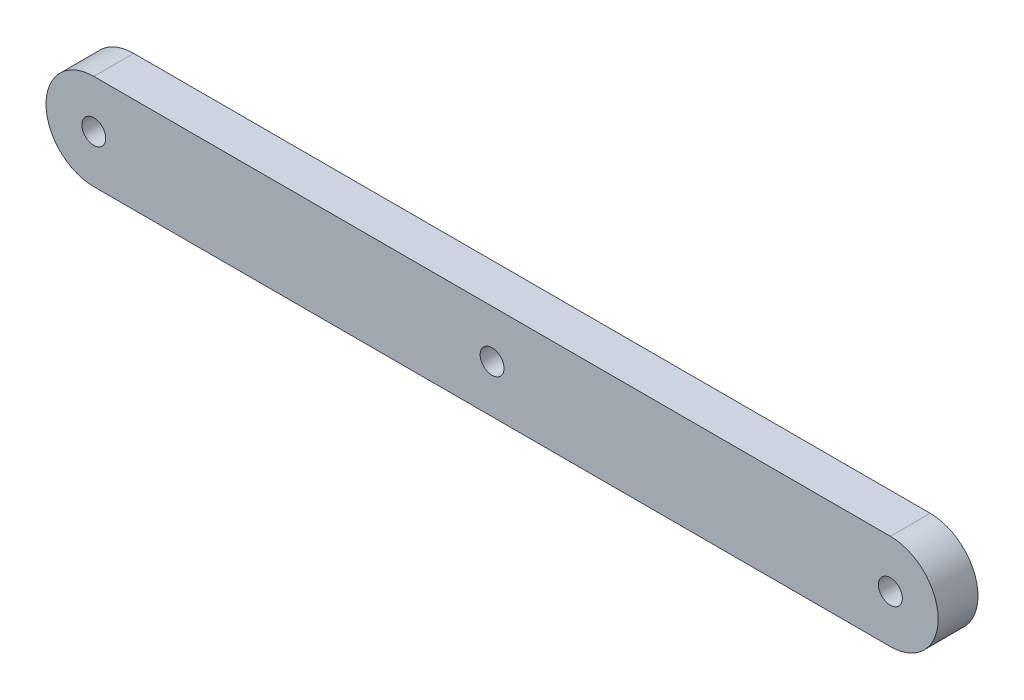
ISO-10303-21;
HEADER;
FILE_DESCRIPTION(('STEP AP214'),'2;1');
FILE_NAME('part.step','',(''),(''),'','','');
FILE_SCHEMA(('AUTOMOTIVE_DESIGN { 1 0 10303 214 1 1 1 1 }'));
ENDSEC;
DATA;
#1=APPLICATION_CONTEXT('core data for automotive mechanical design processes');
#2=APPLICATION_PROTOCOL_DEFINITION('international standard','automotive_design',2000,#1);
#3=PRODUCT_CONTEXT('',#1,'mechanical');
#4=PRODUCT('Part','Part','',(#3));
#5=PRODUCT_RELATED_PRODUCT_CATEGORY('part','',(#4));
#6=PRODUCT_DEFINITION_FORMATION('','',#4);
#7=PRODUCT_DEFINITION_CONTEXT('part definition',#1,'design');
#8=PRODUCT_DEFINITION('design','',#6,#7);
#9=PRODUCT_DEFINITION_SHAPE('','',#8);
#10=(LENGTH_UNIT() NAMED_UNIT(*) SI_UNIT(.MILLI.,.METRE.));
#11=(NAMED_UNIT(*) PLANE_ANGLE_UNIT() SI_UNIT($,.RADIAN.));
#12=(NAMED_UNIT(*) SI_UNIT($,.STERADIAN.) SOLID_ANGLE_UNIT());
#13=UNCERTAINTY_MEASURE_WITH_UNIT(LENGTH_MEASURE(1.E-05),#10,'distance_accuracy_value','');
#14=(GEOMETRIC_REPRESENTATION_CONTEXT(3) GLOBAL_UNCERTAINTY_ASSIGNED_CONTEXT((#13)) GLOBAL_UNIT_ASSIGNED_CONTEXT((#10,
#11,#12)) REPRESENTATION_CONTEXT('',''));
#15=CARTESIAN_POINT('',(0.,0.,0.));
#16=DIRECTION('',(0.,0.,1.));
#17=DIRECTION('',(1.,0.,0.));
#18=AXIS2_PLACEMENT_3D('',#15,#16,#17);
#19=CARTESIAN_POINT('',(-50.,0.,5.));
#20=DIRECTION('',(0.,0.,1.));
#21=DIRECTION('',(1.,0.,0.));
#22=AXIS2_PLACEMENT_3D('',#19,#20,#21);
#23=PLANE('',#22);
#24=CARTESIAN_POINT('',(50.,0.,5.));
#25=DIRECTION('',(0.,0.,1.));
#26=DIRECTION('',(1.,0.,0.));
#27=AXIS2_PLACEMENT_3D('',#24,#25,#26);
#28=CIRCLE('',#27,1.5);
#29=CARTESIAN_POINT('',(51.5,0.,5.));
#30=VERTEX_POINT('',#29);
#31=EDGE_CURVE('E115',#30,#30,#28,.T.);
#32=ORIENTED_EDGE('',*,*,#31,.F.);
#33=EDGE_LOOP('',(#32));
#34=FACE_BOUND('',#33,.T.);
#35=CARTESIAN_POINT('',(-50.,0.,5.));
#36=DIRECTION('',(0.,0.,1.));
#37=DIRECTION('',(1.,0.,0.));
#38=AXIS2_PLACEMENT_3D('',#35,#36,#37);
#39=CIRCLE('',#38,6.);
#40=CARTESIAN_POINT('',(-50.,6.,5.));
#41=VERTEX_POINT('',#40);
#42=CARTESIAN_POINT('',(-50.,-6.,5.));
#43=VERTEX_POINT('',#42);
#44=EDGE_CURVE('E85',#41,#43,#39,.T.);
#45=ORIENTED_EDGE('',*,*,#44,.T.);
#46=DIRECTION('',(1.,0.,0.));
#47=VECTOR('',#46,1.);
#48=CARTESIAN_POINT('',(-50.,-6.,5.));
#49=LINE('',#48,#47);
#50=CARTESIAN_POINT('',(50.,-6.,5.));
#51=VERTEX_POINT('',#50);
#52=EDGE_CURVE('E80',#43,#51,#49,.T.);
#53=ORIENTED_EDGE('',*,*,#52,.T.);
#54=CARTESIAN_POINT('',(50.,0.,5.));
#55=DIRECTION('',(0.,0.,1.));
#56=DIRECTION('',(1.,0.,0.));
#57=AXIS2_PLACEMENT_3D('',#54,#55,#56);
#58=CIRCLE('',#57,6.);
#59=CARTESIAN_POINT('',(50.,6.,5.));
#60=VERTEX_POINT('',#59);
#61=EDGE_CURVE('E83',#51,#60,#58,.T.);
#62=ORIENTED_EDGE('',*,*,#61,.T.);
#63=DIRECTION('',(-1.,0.,0.));
#64=VECTOR('',#63,1.);
#65=CARTESIAN_POINT('',(-50.,6.,5.));
#66=LINE('',#65,#64);
#67=EDGE_CURVE('E50',#60,#41,#66,.T.);
#68=ORIENTED_EDGE('',*,*,#67,.T.);
#69=EDGE_LOOP('',(#45,#53,#62,#68));
#70=FACE_BOUND('',#69,.T.);
#71=CARTESIAN_POINT('',(-50.,0.,5.));
#72=DIRECTION('',(0.,0.,1.));
#73=DIRECTION('',(1.,0.,0.));
#74=AXIS2_PLACEMENT_3D('',#71,#72,#73);
#75=CIRCLE('',#74,1.5);
#76=CARTESIAN_POINT('',(-48.5,0.,5.));
#77=VERTEX_POINT('',#76);
#78=EDGE_CURVE('E100',#77,#77,#75,.T.);
#79=ORIENTED_EDGE('',*,*,#78,.F.);
#80=EDGE_LOOP('',(#79));
#81=FACE_BOUND('',#80,.T.);
#82=CARTESIAN_POINT('',(0.,0.,5.));
#83=DIRECTION('',(0.,0.,1.));
#84=DIRECTION('',(1.,0.,0.));
#85=AXIS2_PLACEMENT_3D('',#82,#83,#84);
#86=CIRCLE('',#85,1.5);
#87=CARTESIAN_POINT('',(1.5,0.,5.));
#88=VERTEX_POINT('',#87);
#89=EDGE_CURVE('E121',#88,#88,#86,.T.);
#90=ORIENTED_EDGE('',*,*,#89,.F.);
#91=EDGE_LOOP('',(#90));
#92=FACE_BOUND('',#91,.T.);
#93=ADVANCED_FACE('F33',(#34,#70,#81,#92),#23,.T.);
#94=CARTESIAN_POINT('',(-50.,0.,0.));
#95=DIRECTION('',(0.,0.,1.));
#96=DIRECTION('',(1.,0.,0.));
#97=AXIS2_PLACEMENT_3D('',#94,#95,#96);
#98=PLANE('',#97);
#99=CARTESIAN_POINT('',(-50.,0.,0.));
#100=DIRECTION('',(0.,0.,1.));
#101=DIRECTION('',(1.,0.,0.));
#102=AXIS2_PLACEMENT_3D('',#99,#100,#101);
#103=CIRCLE('',#102,6.);
#104=CARTESIAN_POINT('',(-50.,6.,0.));
#105=VERTEX_POINT('',#104);
#106=CARTESIAN_POINT('',(-50.,-6.,0.));
#107=VERTEX_POINT('',#106);
#108=EDGE_CURVE('E97',#105,#107,#103,.T.);
#109=ORIENTED_EDGE('',*,*,#108,.F.);
#110=DIRECTION('',(-1.,0.,0.));
#111=VECTOR('',#110,1.);
#112=CARTESIAN_POINT('',(-50.,6.,0.));
#113=LINE('',#112,#111);
#114=CARTESIAN_POINT('',(50.,6.,0.));
#115=VERTEX_POINT('',#114);
#116=EDGE_CURVE('E73',#115,#105,#113,.T.);
#117=ORIENTED_EDGE('',*,*,#116,.F.);
#118=CARTESIAN_POINT('',(50.,0.,0.));
#119=DIRECTION('',(0.,0.,1.));
#120=DIRECTION('',(1.,0.,0.));
#121=AXIS2_PLACEMENT_3D('',#118,#119,#120);
#122=CIRCLE('',#121,6.);
#123=CARTESIAN_POINT('',(50.,-6.,0.));
#124=VERTEX_POINT('',#123);
#125=EDGE_CURVE('E67',#124,#115,#122,.T.);
#126=ORIENTED_EDGE('',*,*,#125,.F.);
#127=DIRECTION('',(1.,0.,0.));
#128=VECTOR('',#127,1.);
#129=CARTESIAN_POINT('',(-50.,-6.,0.));
#130=LINE('',#129,#128);
#131=EDGE_CURVE('E89',#107,#124,#130,.T.);
#132=ORIENTED_EDGE('',*,*,#131,.F.);
#133=EDGE_LOOP('',(#109,#117,#126,#132));
#134=FACE_BOUND('',#133,.T.);
#135=CARTESIAN_POINT('',(-50.,0.,0.));
#136=DIRECTION('',(0.,0.,1.));
#137=DIRECTION('',(1.,0.,0.));
#138=AXIS2_PLACEMENT_3D('',#135,#136,#137);
#139=CIRCLE('',#138,1.5);
#140=CARTESIAN_POINT('',(-48.5,0.,0.));
#141=VERTEX_POINT('',#140);
#142=EDGE_CURVE('E112',#141,#141,#139,.T.);
#143=ORIENTED_EDGE('',*,*,#142,.T.);
#144=EDGE_LOOP('',(#143));
#145=FACE_BOUND('',#144,.T.);
#146=CARTESIAN_POINT('',(50.,0.,0.));
#147=DIRECTION('',(0.,0.,1.));
#148=DIRECTION('',(1.,0.,0.));
#149=AXIS2_PLACEMENT_3D('',#146,#147,#148);
#150=CIRCLE('',#149,1.5);
#151=CARTESIAN_POINT('',(51.5,0.,0.));
#152=VERTEX_POINT('',#151);
#153=EDGE_CURVE('E118',#152,#152,#150,.T.);
#154=ORIENTED_EDGE('',*,*,#153,.T.);
#155=EDGE_LOOP('',(#154));
#156=FACE_BOUND('',#155,.T.);
#157=CARTESIAN_POINT('',(0.,0.,0.));
#158=DIRECTION('',(0.,0.,1.));
#159=DIRECTION('',(1.,0.,0.));
#160=AXIS2_PLACEMENT_3D('',#157,#158,#159);
#161=CIRCLE('',#160,1.5);
#162=CARTESIAN_POINT('',(1.5,0.,0.));
#163=VERTEX_POINT('',#162);
#164=EDGE_CURVE('E124',#163,#163,#161,.T.);
#165=ORIENTED_EDGE('',*,*,#164,.T.);
#166=EDGE_LOOP('',(#165));
#167=FACE_BOUND('',#166,.T.);
#168=ADVANCED_FACE('F108',(#134,#145,#156,#167),#98,.F.);
#169=CARTESIAN_POINT('',(-50.,0.,5.));
#170=DIRECTION('',(0.,0.,-1.));
#171=DIRECTION('',(-1.,0.,0.));
#172=AXIS2_PLACEMENT_3D('',#169,#170,#171);
#173=CYLINDRICAL_SURFACE('',#172,6.);
#174=ORIENTED_EDGE('',*,*,#108,.T.);
#175=DIRECTION('',(0.,0.,-1.));
#176=VECTOR('',#175,1.);
#177=CARTESIAN_POINT('',(-50.,-6.,5.));
#178=LINE('',#177,#176);
#179=EDGE_CURVE('E11',#43,#107,#178,.T.);
#180=ORIENTED_EDGE('',*,*,#179,.F.);
#181=ORIENTED_EDGE('',*,*,#44,.F.);
#182=DIRECTION('',(0.,0.,-1.));
#183=VECTOR('',#182,1.);
#184=CARTESIAN_POINT('',(-50.,6.,5.));
#185=LINE('',#184,#183);
#186=EDGE_CURVE('E93',#41,#105,#185,.T.);
#187=ORIENTED_EDGE('',*,*,#186,.T.);
#188=EDGE_LOOP('',(#174,#180,#181,#187));
#189=FACE_BOUND('',#188,.T.);
#190=ADVANCED_FACE('F35',(#189),#173,.T.);
#191=CARTESIAN_POINT('',(-50.,-6.,5.));
#192=DIRECTION('',(0.,1.,0.));
#193=DIRECTION('',(0.,0.,1.));
#194=AXIS2_PLACEMENT_3D('',#191,#192,#193);
#195=PLANE('',#194);
#196=ORIENTED_EDGE('',*,*,#131,.T.);
#197=DIRECTION('',(0.,0.,-1.));
#198=VECTOR('',#197,1.);
#199=CARTESIAN_POINT('',(50.,-6.,5.));
#200=LINE('',#199,#198);
#201=EDGE_CURVE('E42',#51,#124,#200,.T.);
#202=ORIENTED_EDGE('',*,*,#201,.F.);
#203=ORIENTED_EDGE('',*,*,#52,.F.);
#204=ORIENTED_EDGE('',*,*,#179,.T.);
#205=EDGE_LOOP('',(#196,#202,#203,#204));
#206=FACE_BOUND('',#205,.T.);
#207=ADVANCED_FACE('F88',(#206),#195,.F.);
#208=CARTESIAN_POINT('',(50.,0.,5.));
#209=DIRECTION('',(0.,0.,-1.));
#210=DIRECTION('',(-1.,0.,0.));
#211=AXIS2_PLACEMENT_3D('',#208,#209,#210);
#212=CYLINDRICAL_SURFACE('',#211,6.);
#213=ORIENTED_EDGE('',*,*,#125,.T.);
#214=DIRECTION('',(0.,0.,-1.));
#215=VECTOR('',#214,1.);
#216=CARTESIAN_POINT('',(50.,6.,5.));
#217=LINE('',#216,#215);
#218=EDGE_CURVE('E90',#60,#115,#217,.T.);
#219=ORIENTED_EDGE('',*,*,#218,.F.);
#220=ORIENTED_EDGE('',*,*,#61,.F.);
#221=ORIENTED_EDGE('',*,*,#201,.T.);
#222=EDGE_LOOP('',(#213,#219,#220,#221));
#223=FACE_BOUND('',#222,.T.);
#224=ADVANCED_FACE('F91',(#223),#212,.T.);
#225=CARTESIAN_POINT('',(-50.,6.,5.));
#226=DIRECTION('',(0.,-1.,0.));
#227=DIRECTION('',(0.,0.,-1.));
#228=AXIS2_PLACEMENT_3D('',#225,#226,#227);
#229=PLANE('',#228);
#230=ORIENTED_EDGE('',*,*,#116,.T.);
#231=ORIENTED_EDGE('',*,*,#186,.F.);
#232=ORIENTED_EDGE('',*,*,#67,.F.);
#233=ORIENTED_EDGE('',*,*,#218,.T.);
#234=EDGE_LOOP('',(#230,#231,#232,#233));
#235=FACE_BOUND('',#234,.T.);
#236=ADVANCED_FACE('F105',(#235),#229,.F.);
#237=CARTESIAN_POINT('',(-50.,0.,5.));
#238=DIRECTION('',(0.,0.,-1.));
#239=DIRECTION('',(-1.,0.,0.));
#240=AXIS2_PLACEMENT_3D('',#237,#238,#239);
#241=CYLINDRICAL_SURFACE('',#240,1.5);
#242=ORIENTED_EDGE('',*,*,#78,.T.);
#243=EDGE_LOOP('',(#242));
#244=FACE_BOUND('',#243,.T.);
#245=ORIENTED_EDGE('',*,*,#142,.F.);
#246=EDGE_LOOP('',(#245));
#247=FACE_BOUND('',#246,.T.);
#248=ADVANCED_FACE('F142',(#244,#247),#241,.F.);
#249=CARTESIAN_POINT('',(50.,0.,5.));
#250=DIRECTION('',(0.,0.,-1.));
#251=DIRECTION('',(-1.,0.,0.));
#252=AXIS2_PLACEMENT_3D('',#249,#250,#251);
#253=CYLINDRICAL_SURFACE('',#252,1.5);
#254=ORIENTED_EDGE('',*,*,#31,.T.);
#255=EDGE_LOOP('',(#254));
#256=FACE_BOUND('',#255,.T.);
#257=ORIENTED_EDGE('',*,*,#153,.F.);
#258=EDGE_LOOP('',(#257));
#259=FACE_BOUND('',#258,.T.);
#260=ADVANCED_FACE('F188',(#256,#259),#253,.F.);
#261=CARTESIAN_POINT('',(0.,0.,5.));
#262=DIRECTION('',(0.,0.,-1.));
#263=DIRECTION('',(-1.,0.,0.));
#264=AXIS2_PLACEMENT_3D('',#261,#262,#263);
#265=CYLINDRICAL_SURFACE('',#264,1.5);
#266=ORIENTED_EDGE('',*,*,#89,.T.);
#267=EDGE_LOOP('',(#266));
#268=FACE_BOUND('',#267,.T.);
#269=ORIENTED_EDGE('',*,*,#164,.F.);
#270=EDGE_LOOP('',(#269));
#271=FACE_BOUND('',#270,.T.);
#272=ADVANCED_FACE('F130',(#268,#271),#265,.F.);
#273=CLOSED_SHELL('',(#93,#168,#190,#207,#224,#236,#248,#260,#272));
#274=MANIFOLD_SOLID_BREP('B2',#273);
#275=ADVANCED_BREP_SHAPE_REPRESENTATION('',(#18,#274),#14);
#276=SHAPE_DEFINITION_REPRESENTATION(#9,#275);
ENDSEC;
END-ISO-10303-21;
